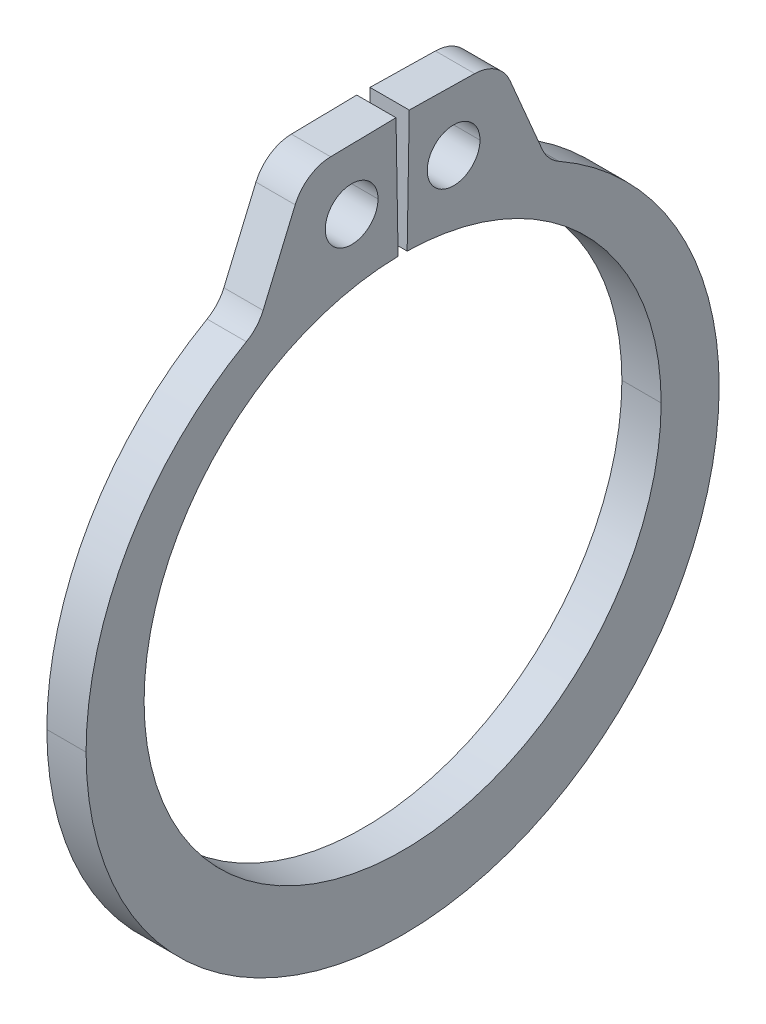
ISO-10303-21;
HEADER;
FILE_DESCRIPTION(('STEP AP214'),'2;1');
FILE_NAME('part.step','',(''),(''),'','','');
FILE_SCHEMA(('AUTOMOTIVE_DESIGN { 1 0 10303 214 1 1 1 1 }'));
ENDSEC;
DATA;
#1=APPLICATION_CONTEXT('core data for automotive mechanical design processes');
#2=APPLICATION_PROTOCOL_DEFINITION('international standard','automotive_design',2000,#1);
#3=PRODUCT_CONTEXT('',#1,'mechanical');
#4=PRODUCT('Part','Part','',(#3));
#5=PRODUCT_RELATED_PRODUCT_CATEGORY('part','',(#4));
#6=PRODUCT_DEFINITION_FORMATION('','',#4);
#7=PRODUCT_DEFINITION_CONTEXT('part definition',#1,'design');
#8=PRODUCT_DEFINITION('design','',#6,#7);
#9=PRODUCT_DEFINITION_SHAPE('','',#8);
#10=(LENGTH_UNIT() NAMED_UNIT(*) SI_UNIT(.MILLI.,.METRE.));
#11=(NAMED_UNIT(*) PLANE_ANGLE_UNIT() SI_UNIT($,.RADIAN.));
#12=(NAMED_UNIT(*) SI_UNIT($,.STERADIAN.) SOLID_ANGLE_UNIT());
#13=UNCERTAINTY_MEASURE_WITH_UNIT(LENGTH_MEASURE(1.E-05),#10,'distance_accuracy_value','');
#14=(GEOMETRIC_REPRESENTATION_CONTEXT(3) GLOBAL_UNCERTAINTY_ASSIGNED_CONTEXT((#13)) GLOBAL_UNIT_ASSIGNED_CONTEXT((#10,
#11,#12)) REPRESENTATION_CONTEXT('',''));
#15=CARTESIAN_POINT('',(0.,0.,0.));
#16=DIRECTION('',(0.,0.,1.));
#17=DIRECTION('',(1.,0.,0.));
#18=AXIS2_PLACEMENT_3D('',#15,#16,#17);
#19=CARTESIAN_POINT('',(0.4445,7.20724610900659,-1.15465964864512));
#20=DIRECTION('',(-1.,0.,0.));
#21=DIRECTION('',(0.,0.,1.));
#22=AXIS2_PLACEMENT_3D('',#19,#20,#21);
#23=CYLINDRICAL_SURFACE('',#22,0.5969);
#24=CARTESIAN_POINT('',(0.4445,7.20724610900659,-1.15465964864512));
#25=DIRECTION('',(1.,0.,0.));
#26=DIRECTION('',(0.,0.,-1.));
#27=AXIS2_PLACEMENT_3D('',#24,#25,#26);
#28=CIRCLE('',#27,0.5969);
#29=CARTESIAN_POINT('',(0.4445,7.20724610900659,-0.557759648645121));
#30=VERTEX_POINT('',#29);
#31=CARTESIAN_POINT('',(0.4445,7.20724610900659,-1.75155964864512));
#32=VERTEX_POINT('',#31);
#33=EDGE_CURVE('E11',#30,#32,#28,.T.);
#34=ORIENTED_EDGE('',*,*,#33,.T.);
#35=DIRECTION('',(-1.,0.,0.));
#36=VECTOR('',#35,1.);
#37=CARTESIAN_POINT('',(0.4445,7.20724610900659,-1.75155964864512));
#38=LINE('',#37,#36);
#39=CARTESIAN_POINT('',(-0.4445,7.20724610900659,-1.75155964864512));
#40=VERTEX_POINT('',#39);
#41=EDGE_CURVE('E27',#32,#40,#38,.T.);
#42=ORIENTED_EDGE('',*,*,#41,.T.);
#43=CARTESIAN_POINT('',(-0.4445,7.20724610900659,-1.15465964864512));
#44=DIRECTION('',(1.,0.,0.));
#45=DIRECTION('',(0.,0.,-1.));
#46=AXIS2_PLACEMENT_3D('',#43,#44,#45);
#47=CIRCLE('',#46,0.5969);
#48=CARTESIAN_POINT('',(-0.4445,7.20724610900659,-0.557759648645121));
#49=VERTEX_POINT('',#48);
#50=EDGE_CURVE('E160',#49,#40,#47,.T.);
#51=ORIENTED_EDGE('',*,*,#50,.F.);
#52=DIRECTION('',(-1.,0.,0.));
#53=VECTOR('',#52,1.);
#54=CARTESIAN_POINT('',(0.4445,7.20724610900659,-0.557759648645121));
#55=LINE('',#54,#53);
#56=EDGE_CURVE('E245',#30,#49,#55,.T.);
#57=ORIENTED_EDGE('',*,*,#56,.F.);
#58=EDGE_LOOP('',(#34,#42,#51,#57));
#59=FACE_BOUND('',#58,.T.);
#60=ADVANCED_FACE('F16',(#59),#23,.F.);
#61=CARTESIAN_POINT('',(0.4445,7.20724610900659,1.15465964864512));
#62=DIRECTION('',(-1.,0.,0.));
#63=DIRECTION('',(0.,0.,1.));
#64=AXIS2_PLACEMENT_3D('',#61,#62,#63);
#65=CYLINDRICAL_SURFACE('',#64,0.5969);
#66=CARTESIAN_POINT('',(0.4445,7.20724610900659,1.15465964864512));
#67=DIRECTION('',(1.,0.,0.));
#68=DIRECTION('',(0.,0.,-1.));
#69=AXIS2_PLACEMENT_3D('',#66,#67,#68);
#70=CIRCLE('',#69,0.5969);
#71=CARTESIAN_POINT('',(0.4445,7.20724610900659,1.75155964864512));
#72=VERTEX_POINT('',#71);
#73=CARTESIAN_POINT('',(0.4445,7.20724610900659,0.557759648645121));
#74=VERTEX_POINT('',#73);
#75=EDGE_CURVE('E200',#72,#74,#70,.T.);
#76=ORIENTED_EDGE('',*,*,#75,.T.);
#77=DIRECTION('',(-1.,0.,0.));
#78=VECTOR('',#77,1.);
#79=CARTESIAN_POINT('',(0.4445,7.20724610900659,0.557759648645121));
#80=LINE('',#79,#78);
#81=CARTESIAN_POINT('',(-0.4445,7.20724610900659,0.557759648645121));
#82=VERTEX_POINT('',#81);
#83=EDGE_CURVE('E140',#74,#82,#80,.T.);
#84=ORIENTED_EDGE('',*,*,#83,.T.);
#85=CARTESIAN_POINT('',(-0.4445,7.20724610900659,1.15465964864512));
#86=DIRECTION('',(1.,0.,0.));
#87=DIRECTION('',(0.,0.,-1.));
#88=AXIS2_PLACEMENT_3D('',#85,#86,#87);
#89=CIRCLE('',#88,0.5969);
#90=CARTESIAN_POINT('',(-0.4445,7.20724610900659,1.75155964864512));
#91=VERTEX_POINT('',#90);
#92=EDGE_CURVE('E192',#91,#82,#89,.T.);
#93=ORIENTED_EDGE('',*,*,#92,.F.);
#94=DIRECTION('',(-1.,0.,0.));
#95=VECTOR('',#94,1.);
#96=CARTESIAN_POINT('',(0.4445,7.20724610900659,1.75155964864512));
#97=LINE('',#96,#95);
#98=EDGE_CURVE('E244',#72,#91,#97,.T.);
#99=ORIENTED_EDGE('',*,*,#98,.F.);
#100=EDGE_LOOP('',(#76,#84,#93,#99));
#101=FACE_BOUND('',#100,.T.);
#102=ADVANCED_FACE('F582',(#101),#65,.F.);
#103=CARTESIAN_POINT('',(0.4445,-0.337057291142251,0.));
#104=DIRECTION('',(-1.,0.,0.));
#105=DIRECTION('',(0.,0.,1.));
#106=AXIS2_PLACEMENT_3D('',#103,#104,#105);
#107=CYLINDRICAL_SURFACE('',#106,7.16864270885775);
#108=CARTESIAN_POINT('',(0.4445,-0.337057291142251,0.));
#109=DIRECTION('',(1.,0.,0.));
#110=DIRECTION('',(0.,0.,-1.));
#111=AXIS2_PLACEMENT_3D('',#108,#109,#110);
#112=CIRCLE('',#111,7.16864270885775);
#113=CARTESIAN_POINT('',(0.4445,-0.33705729114225,-7.16864270885775));
#114=VERTEX_POINT('',#113);
#115=CARTESIAN_POINT('',(0.4445,5.89719335877508,-3.53886381784673));
#116=VERTEX_POINT('',#115);
#117=EDGE_CURVE('E114',#114,#116,#112,.T.);
#118=ORIENTED_EDGE('',*,*,#117,.F.);
#119=DIRECTION('',(-1.,0.,0.));
#120=VECTOR('',#119,1.);
#121=CARTESIAN_POINT('',(0.4445,-0.33705729114225,-7.16864270885775));
#122=LINE('',#121,#120);
#123=CARTESIAN_POINT('',(-0.4445,-0.33705729114225,-7.16864270885775));
#124=VERTEX_POINT('',#123);
#125=EDGE_CURVE('E118',#114,#124,#122,.T.);
#126=ORIENTED_EDGE('',*,*,#125,.T.);
#127=CARTESIAN_POINT('',(-0.4445,-0.337057291142251,0.));
#128=DIRECTION('',(1.,0.,0.));
#129=DIRECTION('',(0.,0.,-1.));
#130=AXIS2_PLACEMENT_3D('',#127,#128,#129);
#131=CIRCLE('',#130,7.16864270885775);
#132=CARTESIAN_POINT('',(-0.4445,5.89719335877508,-3.53886381784673));
#133=VERTEX_POINT('',#132);
#134=EDGE_CURVE('E141',#124,#133,#131,.T.);
#135=ORIENTED_EDGE('',*,*,#134,.T.);
#136=DIRECTION('',(1.,0.,0.));
#137=VECTOR('',#136,1.);
#138=CARTESIAN_POINT('',(0.4445,5.89719335877508,-3.53886381784673));
#139=LINE('',#138,#137);
#140=EDGE_CURVE('E122',#133,#116,#139,.T.);
#141=ORIENTED_EDGE('',*,*,#140,.T.);
#142=EDGE_LOOP('',(#118,#126,#135,#141));
#143=FACE_BOUND('',#142,.T.);
#144=ADVANCED_FACE('F116',(#143),#107,.T.);
#145=CARTESIAN_POINT('',(0.4445,-0.337057291142251,0.));
#146=DIRECTION('',(-1.,0.,0.));
#147=DIRECTION('',(0.,0.,1.));
#148=AXIS2_PLACEMENT_3D('',#145,#146,#147);
#149=CYLINDRICAL_SURFACE('',#148,7.16864270885775);
#150=ORIENTED_EDGE('',*,*,#125,.F.);
#151=CARTESIAN_POINT('',(0.4445,-0.337057291142251,0.));
#152=DIRECTION('',(1.,0.,0.));
#153=DIRECTION('',(0.,0.,-1.));
#154=AXIS2_PLACEMENT_3D('',#151,#152,#153);
#155=CIRCLE('',#154,7.16864270885775);
#156=CARTESIAN_POINT('',(0.4445,-0.337057291142251,7.16864270885775));
#157=VERTEX_POINT('',#156);
#158=EDGE_CURVE('E128',#157,#114,#155,.T.);
#159=ORIENTED_EDGE('',*,*,#158,.F.);
#160=DIRECTION('',(-1.,0.,0.));
#161=VECTOR('',#160,1.);
#162=CARTESIAN_POINT('',(0.4445,-0.337057291142251,7.16864270885775));
#163=LINE('',#162,#161);
#164=CARTESIAN_POINT('',(-0.4445,-0.337057291142251,7.16864270885775));
#165=VERTEX_POINT('',#164);
#166=EDGE_CURVE('E180',#157,#165,#163,.T.);
#167=ORIENTED_EDGE('',*,*,#166,.T.);
#168=CARTESIAN_POINT('',(-0.4445,-0.337057291142251,0.));
#169=DIRECTION('',(1.,0.,0.));
#170=DIRECTION('',(0.,0.,-1.));
#171=AXIS2_PLACEMENT_3D('',#168,#169,#170);
#172=CIRCLE('',#171,7.16864270885775);
#173=EDGE_CURVE('E138',#165,#124,#172,.T.);
#174=ORIENTED_EDGE('',*,*,#173,.T.);
#175=EDGE_LOOP('',(#150,#159,#167,#174));
#176=FACE_BOUND('',#175,.T.);
#177=ADVANCED_FACE('F133',(#176),#149,.T.);
#178=CARTESIAN_POINT('',(0.4445,0.,0.));
#179=DIRECTION('',(-1.,0.,0.));
#180=DIRECTION('',(0.,0.,1.));
#181=AXIS2_PLACEMENT_3D('',#178,#179,#180);
#182=CYLINDRICAL_SURFACE('',#181,5.8547);
#183=CARTESIAN_POINT('',(0.4445,0.,0.));
#184=DIRECTION('',(-1.,0.,0.));
#185=DIRECTION('',(0.,0.,-1.));
#186=AXIS2_PLACEMENT_3D('',#183,#184,#185);
#187=CIRCLE('',#186,5.8547);
#188=CARTESIAN_POINT('',(0.4445,0.,-5.8547));
#189=VERTEX_POINT('',#188);
#190=CARTESIAN_POINT('',(0.4445,0.,5.8547));
#191=VERTEX_POINT('',#190);
#192=EDGE_CURVE('E170',#189,#191,#187,.T.);
#193=ORIENTED_EDGE('',*,*,#192,.F.);
#194=DIRECTION('',(-1.,0.,0.));
#195=VECTOR('',#194,1.);
#196=CARTESIAN_POINT('',(0.4445,0.,-5.8547));
#197=LINE('',#196,#195);
#198=CARTESIAN_POINT('',(-0.4445,0.,-5.8547));
#199=VERTEX_POINT('',#198);
#200=EDGE_CURVE('E205',#189,#199,#197,.T.);
#201=ORIENTED_EDGE('',*,*,#200,.T.);
#202=CARTESIAN_POINT('',(-0.4445,0.,0.));
#203=DIRECTION('',(-1.,0.,0.));
#204=DIRECTION('',(0.,0.,-1.));
#205=AXIS2_PLACEMENT_3D('',#202,#203,#204);
#206=CIRCLE('',#205,5.8547);
#207=CARTESIAN_POINT('',(-0.4445,0.,5.8547));
#208=VERTEX_POINT('',#207);
#209=EDGE_CURVE('E201',#199,#208,#206,.T.);
#210=ORIENTED_EDGE('',*,*,#209,.T.);
#211=DIRECTION('',(-1.,0.,0.));
#212=VECTOR('',#211,1.);
#213=CARTESIAN_POINT('',(0.4445,0.,5.8547));
#214=LINE('',#213,#212);
#215=EDGE_CURVE('E206',#191,#208,#214,.T.);
#216=ORIENTED_EDGE('',*,*,#215,.F.);
#217=EDGE_LOOP('',(#193,#201,#210,#216));
#218=FACE_BOUND('',#217,.T.);
#219=ADVANCED_FACE('F594',(#218),#182,.F.);
#220=CARTESIAN_POINT('',(0.4445,0.,0.));
#221=DIRECTION('',(-1.,0.,0.));
#222=DIRECTION('',(0.,0.,1.));
#223=AXIS2_PLACEMENT_3D('',#220,#221,#222);
#224=CYLINDRICAL_SURFACE('',#223,5.8547);
#225=CARTESIAN_POINT('',(0.4445,0.,0.));
#226=DIRECTION('',(-1.,0.,0.));
#227=DIRECTION('',(0.,0.,-1.));
#228=AXIS2_PLACEMENT_3D('',#225,#226,#227);
#229=CIRCLE('',#228,5.8547);
#230=CARTESIAN_POINT('',(0.4445,5.85380830083212,0.102178603968364));
#231=VERTEX_POINT('',#230);
#232=EDGE_CURVE('E175',#191,#231,#229,.T.);
#233=ORIENTED_EDGE('',*,*,#232,.F.);
#234=ORIENTED_EDGE('',*,*,#215,.T.);
#235=CARTESIAN_POINT('',(-0.4445,0.,0.));
#236=DIRECTION('',(-1.,0.,0.));
#237=DIRECTION('',(0.,0.,-1.));
#238=AXIS2_PLACEMENT_3D('',#235,#236,#237);
#239=CIRCLE('',#238,5.8547);
#240=CARTESIAN_POINT('',(-0.4445,5.85380830083212,0.102178603968364));
#241=VERTEX_POINT('',#240);
#242=EDGE_CURVE('E221',#208,#241,#239,.T.);
#243=ORIENTED_EDGE('',*,*,#242,.T.);
#244=DIRECTION('',(-1.,0.,0.));
#245=VECTOR('',#244,1.);
#246=CARTESIAN_POINT('',(0.4445,5.85380830083212,0.102178603968364));
#247=LINE('',#246,#245);
#248=EDGE_CURVE('E316',#231,#241,#247,.T.);
#249=ORIENTED_EDGE('',*,*,#248,.F.);
#250=EDGE_LOOP('',(#233,#234,#243,#249));
#251=FACE_BOUND('',#250,.T.);
#252=ADVANCED_FACE('F430',(#251),#224,.F.);
#253=CARTESIAN_POINT('',(0.4445,0.,0.));
#254=DIRECTION('',(1.,0.,0.));
#255=DIRECTION('',(0.,1.,0.));
#256=AXIS2_PLACEMENT_3D('',#253,#254,#255);
#257=PLANE('',#256);
#258=DIRECTION('',(0.,-0.0174524064372841,0.999847695156391));
#259=VECTOR('',#258,1.);
#260=CARTESIAN_POINT('',(0.4445,8.59659049818514,0.15005404530712));
#261=LINE('',#260,#259);
#262=CARTESIAN_POINT('',(0.4445,8.59659049818514,0.15005404530712));
#263=VERTEX_POINT('',#262);
#264=CARTESIAN_POINT('',(0.4445,8.57074959100772,1.63047862600547));
#265=VERTEX_POINT('',#264);
#266=EDGE_CURVE('E20',#263,#265,#261,.T.);
#267=ORIENTED_EDGE('',*,*,#266,.T.);
#268=CARTESIAN_POINT('',(0.4445,7.68188499001369,1.61496343668273));
#269=DIRECTION('',(1.,0.,0.));
#270=DIRECTION('',(0.,0.,-1.));
#271=AXIS2_PLACEMENT_3D('',#268,#269,#270);
#272=CIRCLE('',#271,0.889);
#273=CARTESIAN_POINT('',(0.4445,8.02998759243226,2.43297662617872));
#274=VERTEX_POINT('',#273);
#275=EDGE_CURVE('E308',#265,#274,#272,.T.);
#276=ORIENTED_EDGE('',*,*,#275,.T.);
#277=DIRECTION('',(0.,-0.920149819455567,0.391566481910655));
#278=VECTOR('',#277,1.);
#279=CARTESIAN_POINT('',(0.4445,8.56068391718107,2.20714069332188));
#280=LINE('',#279,#278);
#281=CARTESIAN_POINT('',(0.4445,6.32221463110736,3.15971333386378));
#282=VERTEX_POINT('',#281);
#283=EDGE_CURVE('E312',#274,#282,#280,.T.);
#284=ORIENTED_EDGE('',*,*,#283,.T.);
#285=CARTESIAN_POINT('',(0.4445,6.67031723352593,3.97772652335977));
#286=DIRECTION('',(-1.,0.,0.));
#287=DIRECTION('',(0.,0.,-1.));
#288=AXIS2_PLACEMENT_3D('',#285,#286,#287);
#289=CIRCLE('',#288,0.889);
#290=CARTESIAN_POINT('',(0.4445,5.89719335877508,3.53886381784673));
#291=VERTEX_POINT('',#290);
#292=EDGE_CURVE('E156',#282,#291,#289,.T.);
#293=ORIENTED_EDGE('',*,*,#292,.T.);
#294=CARTESIAN_POINT('',(0.4445,-0.337057291142251,0.));
#295=DIRECTION('',(1.,0.,0.));
#296=DIRECTION('',(0.,0.,-1.));
#297=AXIS2_PLACEMENT_3D('',#294,#295,#296);
#298=CIRCLE('',#297,7.16864270885775);
#299=EDGE_CURVE('E148',#291,#157,#298,.T.);
#300=ORIENTED_EDGE('',*,*,#299,.T.);
#301=ORIENTED_EDGE('',*,*,#158,.T.);
#302=ORIENTED_EDGE('',*,*,#117,.T.);
#303=CARTESIAN_POINT('',(0.4445,6.67031723352593,-3.97772652335977));
#304=DIRECTION('',(-1.,0.,0.));
#305=DIRECTION('',(0.,0.,-1.));
#306=AXIS2_PLACEMENT_3D('',#303,#304,#305);
#307=CIRCLE('',#306,0.889);
#308=CARTESIAN_POINT('',(0.4445,6.32221463110736,-3.15971333386378));
#309=VERTEX_POINT('',#308);
#310=EDGE_CURVE('E129',#116,#309,#307,.T.);
#311=ORIENTED_EDGE('',*,*,#310,.T.);
#312=DIRECTION('',(0.,0.920149819455567,0.391566481910655));
#313=VECTOR('',#312,1.);
#314=CARTESIAN_POINT('',(0.4445,8.56068391718107,-2.20714069332188));
#315=LINE('',#314,#313);
#316=CARTESIAN_POINT('',(0.4445,8.02998759243226,-2.43297662617872));
#317=VERTEX_POINT('',#316);
#318=EDGE_CURVE('E162',#309,#317,#315,.T.);
#319=ORIENTED_EDGE('',*,*,#318,.T.);
#320=CARTESIAN_POINT('',(0.4445,7.68188499001369,-1.61496343668273));
#321=DIRECTION('',(1.,0.,0.));
#322=DIRECTION('',(0.,0.,-1.));
#323=AXIS2_PLACEMENT_3D('',#320,#321,#322);
#324=CIRCLE('',#323,0.889);
#325=CARTESIAN_POINT('',(0.4445,8.57074959100772,-1.63047862600547));
#326=VERTEX_POINT('',#325);
#327=EDGE_CURVE('E292',#317,#326,#324,.T.);
#328=ORIENTED_EDGE('',*,*,#327,.T.);
#329=DIRECTION('',(0.,0.0174524064372841,0.999847695156391));
#330=VECTOR('',#329,1.);
#331=CARTESIAN_POINT('',(0.4445,8.59659049818514,-0.15005404530712));
#332=LINE('',#331,#330);
#333=CARTESIAN_POINT('',(0.4445,8.59659049818514,-0.15005404530712));
#334=VERTEX_POINT('',#333);
#335=EDGE_CURVE('E304',#326,#334,#332,.T.);
#336=ORIENTED_EDGE('',*,*,#335,.T.);
#337=DIRECTION('',(0.,-0.999847695156391,0.0174524064372836));
#338=VECTOR('',#337,1.);
#339=CARTESIAN_POINT('',(0.4445,5.85380830083212,-0.102178603968364));
#340=LINE('',#339,#338);
#341=CARTESIAN_POINT('',(0.4445,5.85380830083212,-0.102178603968364));
#342=VERTEX_POINT('',#341);
#343=EDGE_CURVE('E229',#334,#342,#340,.T.);
#344=ORIENTED_EDGE('',*,*,#343,.T.);
#345=CARTESIAN_POINT('',(0.4445,0.,0.));
#346=DIRECTION('',(-1.,0.,0.));
#347=DIRECTION('',(0.,0.,-1.));
#348=AXIS2_PLACEMENT_3D('',#345,#346,#347);
#349=CIRCLE('',#348,5.8547);
#350=EDGE_CURVE('E174',#342,#189,#349,.T.);
#351=ORIENTED_EDGE('',*,*,#350,.T.);
#352=ORIENTED_EDGE('',*,*,#192,.T.);
#353=ORIENTED_EDGE('',*,*,#232,.T.);
#354=DIRECTION('',(0.,0.999847695156391,0.0174524064372836));
#355=VECTOR('',#354,1.);
#356=CARTESIAN_POINT('',(0.4445,5.85380830083212,0.102178603968364));
#357=LINE('',#356,#355);
#358=EDGE_CURVE('E183',#231,#263,#357,.T.);
#359=ORIENTED_EDGE('',*,*,#358,.T.);
#360=EDGE_LOOP('',(#267,#276,#284,#293,#300,#301,#302,#311,#319,#328,#336,#344,#351,#352,#353,#359));
#361=FACE_BOUND('',#360,.T.);
#362=ORIENTED_EDGE('',*,*,#75,.F.);
#363=CARTESIAN_POINT('',(0.4445,7.20724610900659,1.15465964864512));
#364=DIRECTION('',(1.,0.,0.));
#365=DIRECTION('',(0.,0.,-1.));
#366=AXIS2_PLACEMENT_3D('',#363,#364,#365);
#367=CIRCLE('',#366,0.5969);
#368=EDGE_CURVE('E297',#74,#72,#367,.T.);
#369=ORIENTED_EDGE('',*,*,#368,.F.);
#370=EDGE_LOOP('',(#362,#369));
#371=FACE_BOUND('',#370,.T.);
#372=ORIENTED_EDGE('',*,*,#33,.F.);
#373=CARTESIAN_POINT('',(0.4445,7.20724610900659,-1.15465964864512));
#374=DIRECTION('',(1.,0.,0.));
#375=DIRECTION('',(0.,0.,-1.));
#376=AXIS2_PLACEMENT_3D('',#373,#374,#375);
#377=CIRCLE('',#376,0.5969);
#378=EDGE_CURVE('E242',#32,#30,#377,.T.);
#379=ORIENTED_EDGE('',*,*,#378,.F.);
#380=EDGE_LOOP('',(#372,#379));
#381=FACE_BOUND('',#380,.T.);
#382=ADVANCED_FACE('F145',(#361,#371,#381),#257,.T.);
#383=CARTESIAN_POINT('',(-0.4445,0.,0.));
#384=DIRECTION('',(1.,0.,0.));
#385=DIRECTION('',(0.,1.,0.));
#386=AXIS2_PLACEMENT_3D('',#383,#384,#385);
#387=PLANE('',#386);
#388=DIRECTION('',(0.,-0.920149819455567,0.391566481910655));
#389=VECTOR('',#388,1.);
#390=CARTESIAN_POINT('',(-0.4445,8.56068391718107,2.20714069332188));
#391=LINE('',#390,#389);
#392=CARTESIAN_POINT('',(-0.4445,8.02998759243226,2.43297662617872));
#393=VERTEX_POINT('',#392);
#394=CARTESIAN_POINT('',(-0.4445,6.32221463110736,3.15971333386378));
#395=VERTEX_POINT('',#394);
#396=EDGE_CURVE('E234',#393,#395,#391,.T.);
#397=ORIENTED_EDGE('',*,*,#396,.F.);
#398=CARTESIAN_POINT('',(-0.4445,7.68188499001369,1.61496343668273));
#399=DIRECTION('',(-1.,0.,0.));
#400=DIRECTION('',(0.,0.,-1.));
#401=AXIS2_PLACEMENT_3D('',#398,#399,#400);
#402=CIRCLE('',#401,0.889);
#403=CARTESIAN_POINT('',(-0.4445,8.57074959100772,1.63047862600547));
#404=VERTEX_POINT('',#403);
#405=EDGE_CURVE('E187',#393,#404,#402,.T.);
#406=ORIENTED_EDGE('',*,*,#405,.T.);
#407=DIRECTION('',(0.,-0.0174524064372841,0.999847695156391));
#408=VECTOR('',#407,1.);
#409=CARTESIAN_POINT('',(-0.4445,8.59659049818514,0.15005404530712));
#410=LINE('',#409,#408);
#411=CARTESIAN_POINT('',(-0.4445,8.59659049818514,0.15005404530712));
#412=VERTEX_POINT('',#411);
#413=EDGE_CURVE('E268',#412,#404,#410,.T.);
#414=ORIENTED_EDGE('',*,*,#413,.F.);
#415=DIRECTION('',(0.,0.999847695156391,0.0174524064372836));
#416=VECTOR('',#415,1.);
#417=CARTESIAN_POINT('',(-0.4445,5.85380830083212,0.102178603968364));
#418=LINE('',#417,#416);
#419=EDGE_CURVE('E277',#241,#412,#418,.T.);
#420=ORIENTED_EDGE('',*,*,#419,.F.);
#421=ORIENTED_EDGE('',*,*,#242,.F.);
#422=ORIENTED_EDGE('',*,*,#209,.F.);
#423=CARTESIAN_POINT('',(-0.4445,0.,0.));
#424=DIRECTION('',(-1.,0.,0.));
#425=DIRECTION('',(0.,0.,-1.));
#426=AXIS2_PLACEMENT_3D('',#423,#424,#425);
#427=CIRCLE('',#426,5.8547);
#428=CARTESIAN_POINT('',(-0.4445,5.85380830083212,-0.102178603968364));
#429=VERTEX_POINT('',#428);
#430=EDGE_CURVE('E225',#429,#199,#427,.T.);
#431=ORIENTED_EDGE('',*,*,#430,.F.);
#432=DIRECTION('',(0.,-0.999847695156391,0.0174524064372836));
#433=VECTOR('',#432,1.);
#434=CARTESIAN_POINT('',(-0.4445,5.85380830083212,-0.102178603968364));
#435=LINE('',#434,#433);
#436=CARTESIAN_POINT('',(-0.4445,8.59659049818514,-0.15005404530712));
#437=VERTEX_POINT('',#436);
#438=EDGE_CURVE('E275',#437,#429,#435,.T.);
#439=ORIENTED_EDGE('',*,*,#438,.F.);
#440=DIRECTION('',(0.,0.0174524064372841,0.999847695156391));
#441=VECTOR('',#440,1.);
#442=CARTESIAN_POINT('',(-0.4445,8.59659049818514,-0.15005404530712));
#443=LINE('',#442,#441);
#444=CARTESIAN_POINT('',(-0.4445,8.57074959100772,-1.63047862600547));
#445=VERTEX_POINT('',#444);
#446=EDGE_CURVE('E212',#445,#437,#443,.T.);
#447=ORIENTED_EDGE('',*,*,#446,.F.);
#448=CARTESIAN_POINT('',(-0.4445,7.68188499001369,-1.61496343668273));
#449=DIRECTION('',(-1.,0.,0.));
#450=DIRECTION('',(0.,0.,-1.));
#451=AXIS2_PLACEMENT_3D('',#448,#449,#450);
#452=CIRCLE('',#451,0.889);
#453=CARTESIAN_POINT('',(-0.4445,8.02998759243226,-2.43297662617872));
#454=VERTEX_POINT('',#453);
#455=EDGE_CURVE('E288',#445,#454,#452,.T.);
#456=ORIENTED_EDGE('',*,*,#455,.T.);
#457=DIRECTION('',(0.,0.920149819455567,0.391566481910655));
#458=VECTOR('',#457,1.);
#459=CARTESIAN_POINT('',(-0.4445,8.56068391718107,-2.20714069332188));
#460=LINE('',#459,#458);
#461=CARTESIAN_POINT('',(-0.4445,6.32221463110736,-3.15971333386378));
#462=VERTEX_POINT('',#461);
#463=EDGE_CURVE('E196',#462,#454,#460,.T.);
#464=ORIENTED_EDGE('',*,*,#463,.F.);
#465=CARTESIAN_POINT('',(-0.4445,6.67031723352593,-3.97772652335977));
#466=DIRECTION('',(1.,0.,0.));
#467=DIRECTION('',(0.,0.,-1.));
#468=AXIS2_PLACEMENT_3D('',#465,#466,#467);
#469=CIRCLE('',#468,0.889);
#470=EDGE_CURVE('E238',#462,#133,#469,.T.);
#471=ORIENTED_EDGE('',*,*,#470,.T.);
#472=ORIENTED_EDGE('',*,*,#134,.F.);
#473=ORIENTED_EDGE('',*,*,#173,.F.);
#474=CARTESIAN_POINT('',(-0.4445,-0.337057291142251,0.));
#475=DIRECTION('',(1.,0.,0.));
#476=DIRECTION('',(0.,0.,-1.));
#477=AXIS2_PLACEMENT_3D('',#474,#475,#476);
#478=CIRCLE('',#477,7.16864270885775);
#479=CARTESIAN_POINT('',(-0.4445,5.89719335877508,3.53886381784673));
#480=VERTEX_POINT('',#479);
#481=EDGE_CURVE('E168',#480,#165,#478,.T.);
#482=ORIENTED_EDGE('',*,*,#481,.F.);
#483=CARTESIAN_POINT('',(-0.4445,6.67031723352593,3.97772652335977));
#484=DIRECTION('',(1.,0.,0.));
#485=DIRECTION('',(0.,0.,-1.));
#486=AXIS2_PLACEMENT_3D('',#483,#484,#485);
#487=CIRCLE('',#486,0.889);
#488=EDGE_CURVE('E235',#480,#395,#487,.T.);
#489=ORIENTED_EDGE('',*,*,#488,.T.);
#490=EDGE_LOOP('',(#397,#406,#414,#420,#421,#422,#431,#439,#447,#456,#464,#471,#472,#473,#482,#489));
#491=FACE_BOUND('',#490,.T.);
#492=ORIENTED_EDGE('',*,*,#92,.T.);
#493=CARTESIAN_POINT('',(-0.4445,7.20724610900659,1.15465964864512));
#494=DIRECTION('',(1.,0.,0.));
#495=DIRECTION('',(0.,0.,-1.));
#496=AXIS2_PLACEMENT_3D('',#493,#494,#495);
#497=CIRCLE('',#496,0.5969);
#498=EDGE_CURVE('E188',#82,#91,#497,.T.);
#499=ORIENTED_EDGE('',*,*,#498,.T.);
#500=EDGE_LOOP('',(#492,#499));
#501=FACE_BOUND('',#500,.T.);
#502=ORIENTED_EDGE('',*,*,#50,.T.);
#503=CARTESIAN_POINT('',(-0.4445,7.20724610900659,-1.15465964864512));
#504=DIRECTION('',(1.,0.,0.));
#505=DIRECTION('',(0.,0.,-1.));
#506=AXIS2_PLACEMENT_3D('',#503,#504,#505);
#507=CIRCLE('',#506,0.5969);
#508=EDGE_CURVE('E213',#40,#49,#507,.T.);
#509=ORIENTED_EDGE('',*,*,#508,.T.);
#510=EDGE_LOOP('',(#502,#509));
#511=FACE_BOUND('',#510,.T.);
#512=ADVANCED_FACE('F382',(#491,#501,#511),#387,.F.);
#513=CARTESIAN_POINT('',(0.4445,0.,0.));
#514=DIRECTION('',(-1.,0.,0.));
#515=DIRECTION('',(0.,0.,1.));
#516=AXIS2_PLACEMENT_3D('',#513,#514,#515);
#517=CYLINDRICAL_SURFACE('',#516,5.8547);
#518=ORIENTED_EDGE('',*,*,#200,.F.);
#519=ORIENTED_EDGE('',*,*,#350,.F.);
#520=DIRECTION('',(-1.,0.,0.));
#521=VECTOR('',#520,1.);
#522=CARTESIAN_POINT('',(0.4445,5.85380830083212,-0.102178603968364));
#523=LINE('',#522,#521);
#524=EDGE_CURVE('E217',#342,#429,#523,.T.);
#525=ORIENTED_EDGE('',*,*,#524,.T.);
#526=ORIENTED_EDGE('',*,*,#430,.T.);
#527=EDGE_LOOP('',(#518,#519,#525,#526));
#528=FACE_BOUND('',#527,.T.);
#529=ADVANCED_FACE('F345',(#528),#517,.F.);
#530=CARTESIAN_POINT('',(0.4445,5.85380830083212,0.102178603968364));
#531=DIRECTION('',(0.,-0.0174524064372836,0.999847695156391));
#532=DIRECTION('',(-1.,0.,0.));
#533=AXIS2_PLACEMENT_3D('',#530,#531,#532);
#534=PLANE('',#533);
#535=ORIENTED_EDGE('',*,*,#419,.T.);
#536=DIRECTION('',(-1.,0.,0.));
#537=VECTOR('',#536,1.);
#538=CARTESIAN_POINT('',(0.4445,8.59659049818514,0.15005404530712));
#539=LINE('',#538,#537);
#540=EDGE_CURVE('E269',#263,#412,#539,.T.);
#541=ORIENTED_EDGE('',*,*,#540,.F.);
#542=ORIENTED_EDGE('',*,*,#358,.F.);
#543=ORIENTED_EDGE('',*,*,#248,.T.);
#544=EDGE_LOOP('',(#535,#541,#542,#543));
#545=FACE_BOUND('',#544,.T.);
#546=ADVANCED_FACE('F428',(#545),#534,.F.);
#547=CARTESIAN_POINT('',(0.4445,8.59659049818514,0.15005404530712));
#548=DIRECTION('',(0.,-0.999847695156391,-0.0174524064372841));
#549=DIRECTION('',(0.,0.0174524064372841,-0.999847695156391));
#550=AXIS2_PLACEMENT_3D('',#547,#548,#549);
#551=PLANE('',#550);
#552=ORIENTED_EDGE('',*,*,#413,.T.);
#553=DIRECTION('',(1.,0.,0.));
#554=VECTOR('',#553,1.);
#555=CARTESIAN_POINT('',(0.4445,8.57074959100772,1.63047862600547));
#556=LINE('',#555,#554);
#557=EDGE_CURVE('E265',#404,#265,#556,.T.);
#558=ORIENTED_EDGE('',*,*,#557,.T.);
#559=ORIENTED_EDGE('',*,*,#266,.F.);
#560=ORIENTED_EDGE('',*,*,#540,.T.);
#561=EDGE_LOOP('',(#552,#558,#559,#560));
#562=FACE_BOUND('',#561,.T.);
#563=ADVANCED_FACE('F377',(#562),#551,.F.);
#564=CARTESIAN_POINT('',(0.4445,8.56068391718107,2.20714069332188));
#565=DIRECTION('',(0.,-0.391566481910655,-0.920149819455567));
#566=DIRECTION('',(0.,-0.920149819455567,0.391566481910655));
#567=AXIS2_PLACEMENT_3D('',#564,#565,#566);
#568=PLANE('',#567);
#569=ORIENTED_EDGE('',*,*,#396,.T.);
#570=DIRECTION('',(1.,0.,0.));
#571=VECTOR('',#570,1.);
#572=CARTESIAN_POINT('',(0.4445,6.32221463110736,3.15971333386378));
#573=LINE('',#572,#571);
#574=EDGE_CURVE('E230',#395,#282,#573,.T.);
#575=ORIENTED_EDGE('',*,*,#574,.T.);
#576=ORIENTED_EDGE('',*,*,#283,.F.);
#577=DIRECTION('',(-1.,0.,0.));
#578=VECTOR('',#577,1.);
#579=CARTESIAN_POINT('',(0.4445,8.02998759243226,2.43297662617872));
#580=LINE('',#579,#578);
#581=EDGE_CURVE('E167',#274,#393,#580,.T.);
#582=ORIENTED_EDGE('',*,*,#581,.T.);
#583=EDGE_LOOP('',(#569,#575,#576,#582));
#584=FACE_BOUND('',#583,.T.);
#585=ADVANCED_FACE('F653',(#584),#568,.F.);
#586=CARTESIAN_POINT('',(0.4445,-0.337057291142251,0.));
#587=DIRECTION('',(-1.,0.,0.));
#588=DIRECTION('',(0.,0.,1.));
#589=AXIS2_PLACEMENT_3D('',#586,#587,#588);
#590=CYLINDRICAL_SURFACE('',#589,7.16864270885775);
#591=ORIENTED_EDGE('',*,*,#166,.F.);
#592=ORIENTED_EDGE('',*,*,#299,.F.);
#593=DIRECTION('',(-1.,0.,0.));
#594=VECTOR('',#593,1.);
#595=CARTESIAN_POINT('',(0.4445,5.89719335877508,3.53886381784673));
#596=LINE('',#595,#594);
#597=EDGE_CURVE('E164',#291,#480,#596,.T.);
#598=ORIENTED_EDGE('',*,*,#597,.T.);
#599=ORIENTED_EDGE('',*,*,#481,.T.);
#600=EDGE_LOOP('',(#591,#592,#598,#599));
#601=FACE_BOUND('',#600,.T.);
#602=ADVANCED_FACE('F604',(#601),#590,.T.);
#603=CARTESIAN_POINT('',(0.4445,8.56068391718107,-2.20714069332188));
#604=DIRECTION('',(0.,-0.391566481910655,0.920149819455567));
#605=DIRECTION('',(-1.,0.,0.));
#606=AXIS2_PLACEMENT_3D('',#603,#604,#605);
#607=PLANE('',#606);
#608=ORIENTED_EDGE('',*,*,#318,.F.);
#609=DIRECTION('',(-1.,0.,0.));
#610=VECTOR('',#609,1.);
#611=CARTESIAN_POINT('',(-0.4445,6.32221463110736,-3.15971333386378));
#612=LINE('',#611,#610);
#613=EDGE_CURVE('E179',#309,#462,#612,.T.);
#614=ORIENTED_EDGE('',*,*,#613,.T.);
#615=ORIENTED_EDGE('',*,*,#463,.T.);
#616=DIRECTION('',(1.,0.,0.));
#617=VECTOR('',#616,1.);
#618=CARTESIAN_POINT('',(0.4445,8.02998759243226,-2.43297662617872));
#619=LINE('',#618,#617);
#620=EDGE_CURVE('E211',#454,#317,#619,.T.);
#621=ORIENTED_EDGE('',*,*,#620,.T.);
#622=EDGE_LOOP('',(#608,#614,#615,#621));
#623=FACE_BOUND('',#622,.T.);
#624=ADVANCED_FACE('F599',(#623),#607,.F.);
#625=CARTESIAN_POINT('',(0.4445,8.59659049818514,-0.15005404530712));
#626=DIRECTION('',(0.,-0.999847695156391,0.0174524064372841));
#627=DIRECTION('',(-1.,0.,0.));
#628=AXIS2_PLACEMENT_3D('',#625,#626,#627);
#629=PLANE('',#628);
#630=ORIENTED_EDGE('',*,*,#335,.F.);
#631=DIRECTION('',(-1.,0.,0.));
#632=VECTOR('',#631,1.);
#633=CARTESIAN_POINT('',(0.4445,8.57074959100772,-1.63047862600547));
#634=LINE('',#633,#632);
#635=EDGE_CURVE('E207',#326,#445,#634,.T.);
#636=ORIENTED_EDGE('',*,*,#635,.T.);
#637=ORIENTED_EDGE('',*,*,#446,.T.);
#638=DIRECTION('',(-1.,0.,0.));
#639=VECTOR('',#638,1.);
#640=CARTESIAN_POINT('',(0.4445,8.59659049818514,-0.15005404530712));
#641=LINE('',#640,#639);
#642=EDGE_CURVE('E296',#334,#437,#641,.T.);
#643=ORIENTED_EDGE('',*,*,#642,.F.);
#644=EDGE_LOOP('',(#630,#636,#637,#643));
#645=FACE_BOUND('',#644,.T.);
#646=ADVANCED_FACE('F603',(#645),#629,.F.);
#647=CARTESIAN_POINT('',(0.4445,5.85380830083212,-0.102178603968364));
#648=DIRECTION('',(0.,-0.0174524064372836,-0.999847695156391));
#649=DIRECTION('',(0.,-0.999847695156391,0.0174524064372836));
#650=AXIS2_PLACEMENT_3D('',#647,#648,#649);
#651=PLANE('',#650);
#652=ORIENTED_EDGE('',*,*,#438,.T.);
#653=ORIENTED_EDGE('',*,*,#524,.F.);
#654=ORIENTED_EDGE('',*,*,#343,.F.);
#655=ORIENTED_EDGE('',*,*,#642,.T.);
#656=EDGE_LOOP('',(#652,#653,#654,#655));
#657=FACE_BOUND('',#656,.T.);
#658=ADVANCED_FACE('F18',(#657),#651,.F.);
#659=CARTESIAN_POINT('',(0.4445,7.20724610900659,1.15465964864512));
#660=DIRECTION('',(-1.,0.,0.));
#661=DIRECTION('',(0.,0.,1.));
#662=AXIS2_PLACEMENT_3D('',#659,#660,#661);
#663=CYLINDRICAL_SURFACE('',#662,0.5969);
#664=ORIENTED_EDGE('',*,*,#83,.F.);
#665=ORIENTED_EDGE('',*,*,#368,.T.);
#666=ORIENTED_EDGE('',*,*,#98,.T.);
#667=ORIENTED_EDGE('',*,*,#498,.F.);
#668=EDGE_LOOP('',(#664,#665,#666,#667));
#669=FACE_BOUND('',#668,.T.);
#670=ADVANCED_FACE('F633',(#669),#663,.F.);
#671=CARTESIAN_POINT('',(0.4445,7.20724610900659,-1.15465964864512));
#672=DIRECTION('',(-1.,0.,0.));
#673=DIRECTION('',(0.,0.,1.));
#674=AXIS2_PLACEMENT_3D('',#671,#672,#673);
#675=CYLINDRICAL_SURFACE('',#674,0.5969);
#676=ORIENTED_EDGE('',*,*,#41,.F.);
#677=ORIENTED_EDGE('',*,*,#378,.T.);
#678=ORIENTED_EDGE('',*,*,#56,.T.);
#679=ORIENTED_EDGE('',*,*,#508,.F.);
#680=EDGE_LOOP('',(#676,#677,#678,#679));
#681=FACE_BOUND('',#680,.T.);
#682=ADVANCED_FACE('F637',(#681),#675,.F.);
#683=CARTESIAN_POINT('',(0.4445,6.67031723352593,3.97772652335977));
#684=DIRECTION('',(-1.,0.,0.));
#685=DIRECTION('',(0.,0.,1.));
#686=AXIS2_PLACEMENT_3D('',#683,#684,#685);
#687=CYLINDRICAL_SURFACE('',#686,0.889);
#688=ORIENTED_EDGE('',*,*,#292,.F.);
#689=ORIENTED_EDGE('',*,*,#574,.F.);
#690=ORIENTED_EDGE('',*,*,#488,.F.);
#691=ORIENTED_EDGE('',*,*,#597,.F.);
#692=EDGE_LOOP('',(#688,#689,#690,#691));
#693=FACE_BOUND('',#692,.T.);
#694=ADVANCED_FACE('F643',(#693),#687,.F.);
#695=CARTESIAN_POINT('',(0.4445,6.67031723352593,-3.97772652335977));
#696=DIRECTION('',(-1.,0.,0.));
#697=DIRECTION('',(0.,0.,1.));
#698=AXIS2_PLACEMENT_3D('',#695,#696,#697);
#699=CYLINDRICAL_SURFACE('',#698,0.889);
#700=ORIENTED_EDGE('',*,*,#310,.F.);
#701=ORIENTED_EDGE('',*,*,#140,.F.);
#702=ORIENTED_EDGE('',*,*,#470,.F.);
#703=ORIENTED_EDGE('',*,*,#613,.F.);
#704=EDGE_LOOP('',(#700,#701,#702,#703));
#705=FACE_BOUND('',#704,.T.);
#706=ADVANCED_FACE('F647',(#705),#699,.F.);
#707=CARTESIAN_POINT('',(0.4445,7.68188499001369,1.61496343668273));
#708=DIRECTION('',(-1.,0.,0.));
#709=DIRECTION('',(0.,0.,1.));
#710=AXIS2_PLACEMENT_3D('',#707,#708,#709);
#711=CYLINDRICAL_SURFACE('',#710,0.889);
#712=ORIENTED_EDGE('',*,*,#275,.F.);
#713=ORIENTED_EDGE('',*,*,#557,.F.);
#714=ORIENTED_EDGE('',*,*,#405,.F.);
#715=ORIENTED_EDGE('',*,*,#581,.F.);
#716=EDGE_LOOP('',(#712,#713,#714,#715));
#717=FACE_BOUND('',#716,.T.);
#718=ADVANCED_FACE('F388',(#717),#711,.T.);
#719=CARTESIAN_POINT('',(0.4445,7.68188499001369,-1.61496343668273));
#720=DIRECTION('',(-1.,0.,0.));
#721=DIRECTION('',(0.,0.,1.));
#722=AXIS2_PLACEMENT_3D('',#719,#720,#721);
#723=CYLINDRICAL_SURFACE('',#722,0.889);
#724=ORIENTED_EDGE('',*,*,#327,.F.);
#725=ORIENTED_EDGE('',*,*,#620,.F.);
#726=ORIENTED_EDGE('',*,*,#455,.F.);
#727=ORIENTED_EDGE('',*,*,#635,.F.);
#728=EDGE_LOOP('',(#724,#725,#726,#727));
#729=FACE_BOUND('',#728,.T.);
#730=ADVANCED_FACE('F662',(#729),#723,.T.);
#731=CLOSED_SHELL('',(#60,#102,#144,#177,#219,#252,#382,#512,#529,#546,#563,#585,#602,#624,#646,
#658,#670,#682,#694,#706,#718,#730));
#732=MANIFOLD_SOLID_BREP('B1',#731);
#733=ADVANCED_BREP_SHAPE_REPRESENTATION('',(#18,#732),#14);
#734=SHAPE_DEFINITION_REPRESENTATION(#9,#733);
ENDSEC;
END-ISO-10303-21;
